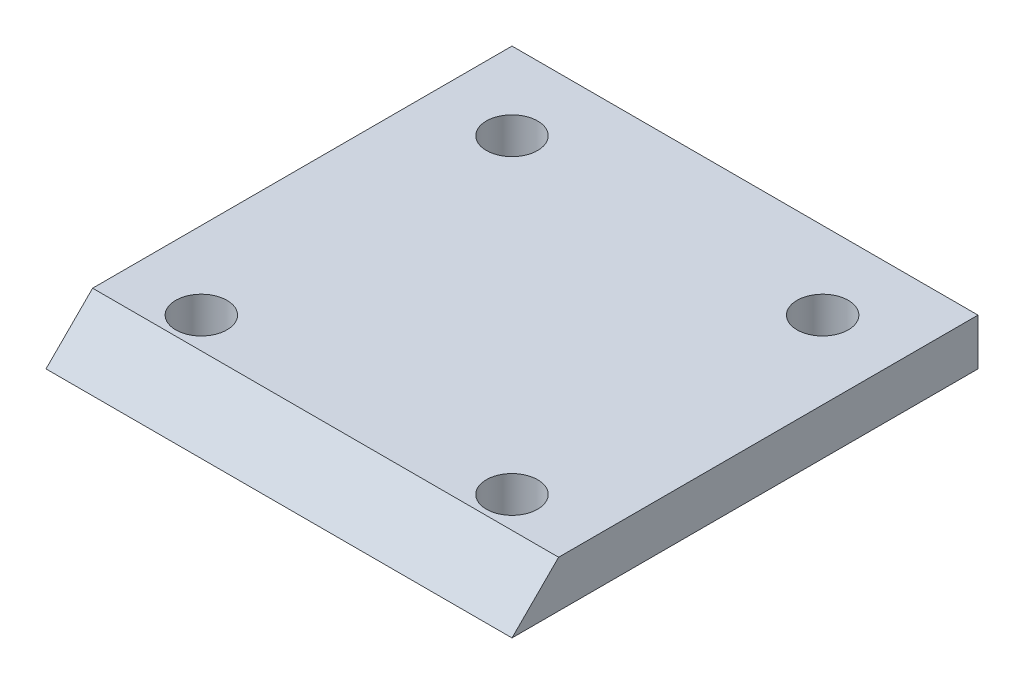
ISO-10303-21;
HEADER;
FILE_DESCRIPTION(('STEP AP214'),'2;1');
FILE_NAME('part.step','',(''),(''),'','','');
FILE_SCHEMA(('AUTOMOTIVE_DESIGN { 1 0 10303 214 1 1 1 1 }'));
ENDSEC;
DATA;
#1=APPLICATION_CONTEXT('core data for automotive mechanical design processes');
#2=APPLICATION_PROTOCOL_DEFINITION('international standard','automotive_design',2000,#1);
#3=PRODUCT_CONTEXT('',#1,'mechanical');
#4=PRODUCT('Part','Part','',(#3));
#5=PRODUCT_RELATED_PRODUCT_CATEGORY('part','',(#4));
#6=PRODUCT_DEFINITION_FORMATION('','',#4);
#7=PRODUCT_DEFINITION_CONTEXT('part definition',#1,'design');
#8=PRODUCT_DEFINITION('design','',#6,#7);
#9=PRODUCT_DEFINITION_SHAPE('','',#8);
#10=(LENGTH_UNIT() NAMED_UNIT(*) SI_UNIT(.MILLI.,.METRE.));
#11=(NAMED_UNIT(*) PLANE_ANGLE_UNIT() SI_UNIT($,.RADIAN.));
#12=(NAMED_UNIT(*) SI_UNIT($,.STERADIAN.) SOLID_ANGLE_UNIT());
#13=UNCERTAINTY_MEASURE_WITH_UNIT(LENGTH_MEASURE(1.E-05),#10,'distance_accuracy_value','');
#14=(GEOMETRIC_REPRESENTATION_CONTEXT(3) GLOBAL_UNCERTAINTY_ASSIGNED_CONTEXT((#13)) GLOBAL_UNIT_ASSIGNED_CONTEXT((#10,
#11,#12)) REPRESENTATION_CONTEXT('',''));
#15=CARTESIAN_POINT('',(0.,0.,0.));
#16=DIRECTION('',(0.,0.,1.));
#17=DIRECTION('',(1.,0.,0.));
#18=AXIS2_PLACEMENT_3D('',#15,#16,#17);
#19=CARTESIAN_POINT('',(15.,3.,15.));
#20=DIRECTION('',(-1.,0.,0.));
#21=DIRECTION('',(0.,0.,1.));
#22=AXIS2_PLACEMENT_3D('',#19,#20,#21);
#23=PLANE('',#22);
#24=DIRECTION('',(0.,0.,-1.));
#25=VECTOR('',#24,1.);
#26=CARTESIAN_POINT('',(15.,3.,15.));
#27=LINE('',#26,#25);
#28=CARTESIAN_POINT('',(15.,3.,12.));
#29=VERTEX_POINT('',#28);
#30=CARTESIAN_POINT('',(15.,3.,-15.));
#31=VERTEX_POINT('',#30);
#32=EDGE_CURVE('E82',#29,#31,#27,.T.);
#33=ORIENTED_EDGE('',*,*,#32,.F.);
#34=DIRECTION('',(0.,0.707106781186548,-0.707106781186547));
#35=VECTOR('',#34,1.);
#36=CARTESIAN_POINT('',(15.,3.,12.));
#37=LINE('',#36,#35);
#38=CARTESIAN_POINT('',(15.,0.,15.));
#39=VERTEX_POINT('',#38);
#40=EDGE_CURVE('E51',#29,#39,#37,.F.);
#41=ORIENTED_EDGE('',*,*,#40,.T.);
#42=DIRECTION('',(0.,0.,-1.));
#43=VECTOR('',#42,1.);
#44=CARTESIAN_POINT('',(15.,0.,15.));
#45=LINE('',#44,#43);
#46=CARTESIAN_POINT('',(15.,0.,-15.));
#47=VERTEX_POINT('',#46);
#48=EDGE_CURVE('E104',#39,#47,#45,.T.);
#49=ORIENTED_EDGE('',*,*,#48,.T.);
#50=DIRECTION('',(0.,-1.,0.));
#51=VECTOR('',#50,1.);
#52=CARTESIAN_POINT('',(15.,3.,-15.));
#53=LINE('',#52,#51);
#54=EDGE_CURVE('E96',#31,#47,#53,.T.);
#55=ORIENTED_EDGE('',*,*,#54,.F.);
#56=EDGE_LOOP('',(#33,#41,#49,#55));
#57=FACE_BOUND('',#56,.T.);
#58=ADVANCED_FACE('F41',(#57),#23,.F.);
#59=CARTESIAN_POINT('',(-15.,3.,-15.));
#60=DIRECTION('',(0.,0.,1.));
#61=DIRECTION('',(1.,0.,0.));
#62=AXIS2_PLACEMENT_3D('',#59,#60,#61);
#63=PLANE('',#62);
#64=DIRECTION('',(-1.,0.,0.));
#65=VECTOR('',#64,1.);
#66=CARTESIAN_POINT('',(-15.,0.,-15.));
#67=LINE('',#66,#65);
#68=CARTESIAN_POINT('',(-15.,0.,-15.));
#69=VERTEX_POINT('',#68);
#70=EDGE_CURVE('E117',#47,#69,#67,.T.);
#71=ORIENTED_EDGE('',*,*,#70,.T.);
#72=DIRECTION('',(0.,-1.,0.));
#73=VECTOR('',#72,1.);
#74=CARTESIAN_POINT('',(-15.,3.,-15.));
#75=LINE('',#74,#73);
#76=CARTESIAN_POINT('',(-15.,3.,-15.));
#77=VERTEX_POINT('',#76);
#78=EDGE_CURVE('E99',#77,#69,#75,.T.);
#79=ORIENTED_EDGE('',*,*,#78,.F.);
#80=DIRECTION('',(-1.,0.,0.));
#81=VECTOR('',#80,1.);
#82=CARTESIAN_POINT('',(-15.,3.,-15.));
#83=LINE('',#82,#81);
#84=EDGE_CURVE('E85',#31,#77,#83,.T.);
#85=ORIENTED_EDGE('',*,*,#84,.F.);
#86=ORIENTED_EDGE('',*,*,#54,.T.);
#87=EDGE_LOOP('',(#71,#79,#85,#86));
#88=FACE_BOUND('',#87,.T.);
#89=ADVANCED_FACE('F95',(#88),#63,.F.);
#90=CARTESIAN_POINT('',(-15.,3.,15.));
#91=DIRECTION('',(1.,0.,0.));
#92=DIRECTION('',(0.,0.,-1.));
#93=AXIS2_PLACEMENT_3D('',#90,#91,#92);
#94=PLANE('',#93);
#95=DIRECTION('',(0.,0.,1.));
#96=VECTOR('',#95,1.);
#97=CARTESIAN_POINT('',(-15.,0.,15.));
#98=LINE('',#97,#96);
#99=CARTESIAN_POINT('',(-15.,0.,15.));
#100=VERTEX_POINT('',#99);
#101=EDGE_CURVE('E122',#69,#100,#98,.T.);
#102=ORIENTED_EDGE('',*,*,#101,.T.);
#103=DIRECTION('',(0.,-0.707106781186548,0.707106781186547));
#104=VECTOR('',#103,1.);
#105=CARTESIAN_POINT('',(-15.,3.,12.));
#106=LINE('',#105,#104);
#107=CARTESIAN_POINT('',(-15.,3.,12.));
#108=VERTEX_POINT('',#107);
#109=EDGE_CURVE('E11',#100,#108,#106,.F.);
#110=ORIENTED_EDGE('',*,*,#109,.T.);
#111=DIRECTION('',(0.,0.,1.));
#112=VECTOR('',#111,1.);
#113=CARTESIAN_POINT('',(-15.,3.,15.));
#114=LINE('',#113,#112);
#115=EDGE_CURVE('E101',#77,#108,#114,.T.);
#116=ORIENTED_EDGE('',*,*,#115,.F.);
#117=ORIENTED_EDGE('',*,*,#78,.T.);
#118=EDGE_LOOP('',(#102,#110,#116,#117));
#119=FACE_BOUND('',#118,.T.);
#120=ADVANCED_FACE('F166',(#119),#94,.F.);
#121=CARTESIAN_POINT('',(0.,3.,0.));
#122=DIRECTION('',(0.,-1.,0.));
#123=DIRECTION('',(0.,0.,-1.));
#124=AXIS2_PLACEMENT_3D('',#121,#122,#123);
#125=PLANE('',#124);
#126=CARTESIAN_POINT('',(-10.,3.,-10.));
#127=DIRECTION('',(0.,1.,0.));
#128=DIRECTION('',(0.,0.,1.));
#129=AXIS2_PLACEMENT_3D('',#126,#127,#128);
#130=CIRCLE('',#129,1.65);
#131=CARTESIAN_POINT('',(-10.,3.,-8.35));
#132=VERTEX_POINT('',#131);
#133=EDGE_CURVE('E157',#132,#132,#130,.T.);
#134=ORIENTED_EDGE('',*,*,#133,.F.);
#135=EDGE_LOOP('',(#134));
#136=FACE_BOUND('',#135,.T.);
#137=CARTESIAN_POINT('',(10.,3.,-10.));
#138=DIRECTION('',(0.,1.,0.));
#139=DIRECTION('',(0.,0.,1.));
#140=AXIS2_PLACEMENT_3D('',#137,#138,#139);
#141=CIRCLE('',#140,1.65);
#142=CARTESIAN_POINT('',(10.,3.,-8.35));
#143=VERTEX_POINT('',#142);
#144=EDGE_CURVE('E149',#143,#143,#141,.T.);
#145=ORIENTED_EDGE('',*,*,#144,.F.);
#146=EDGE_LOOP('',(#145));
#147=FACE_BOUND('',#146,.T.);
#148=CARTESIAN_POINT('',(10.,3.,10.));
#149=DIRECTION('',(0.,1.,0.));
#150=DIRECTION('',(0.,0.,1.));
#151=AXIS2_PLACEMENT_3D('',#148,#149,#150);
#152=CIRCLE('',#151,1.65);
#153=CARTESIAN_POINT('',(10.,3.,11.65));
#154=VERTEX_POINT('',#153);
#155=EDGE_CURVE('E141',#154,#154,#152,.T.);
#156=ORIENTED_EDGE('',*,*,#155,.F.);
#157=EDGE_LOOP('',(#156));
#158=FACE_BOUND('',#157,.T.);
#159=CARTESIAN_POINT('',(-10.,3.,10.));
#160=DIRECTION('',(0.,1.,0.));
#161=DIRECTION('',(0.,0.,1.));
#162=AXIS2_PLACEMENT_3D('',#159,#160,#161);
#163=CIRCLE('',#162,1.65);
#164=CARTESIAN_POINT('',(-10.,3.,11.65));
#165=VERTEX_POINT('',#164);
#166=EDGE_CURVE('E133',#165,#165,#163,.T.);
#167=ORIENTED_EDGE('',*,*,#166,.F.);
#168=EDGE_LOOP('',(#167));
#169=FACE_BOUND('',#168,.T.);
#170=ORIENTED_EDGE('',*,*,#115,.T.);
#171=DIRECTION('',(1.,0.,0.));
#172=VECTOR('',#171,1.);
#173=CARTESIAN_POINT('',(0.,3.,12.));
#174=LINE('',#173,#172);
#175=EDGE_CURVE('E87',#108,#29,#174,.T.);
#176=ORIENTED_EDGE('',*,*,#175,.T.);
#177=ORIENTED_EDGE('',*,*,#32,.T.);
#178=ORIENTED_EDGE('',*,*,#84,.T.);
#179=EDGE_LOOP('',(#170,#176,#177,#178));
#180=FACE_BOUND('',#179,.T.);
#181=ADVANCED_FACE('F84',(#136,#147,#158,#169,#180),#125,.F.);
#182=CARTESIAN_POINT('',(0.,0.,0.));
#183=DIRECTION('',(0.,-1.,0.));
#184=DIRECTION('',(0.,0.,-1.));
#185=AXIS2_PLACEMENT_3D('',#182,#183,#184);
#186=PLANE('',#185);
#187=CARTESIAN_POINT('',(-10.,0.,-10.));
#188=DIRECTION('',(0.,1.,0.));
#189=DIRECTION('',(0.,0.,1.));
#190=AXIS2_PLACEMENT_3D('',#187,#188,#189);
#191=CIRCLE('',#190,1.65);
#192=CARTESIAN_POINT('',(-10.,0.,-8.35));
#193=VERTEX_POINT('',#192);
#194=EDGE_CURVE('E153',#193,#193,#191,.T.);
#195=ORIENTED_EDGE('',*,*,#194,.T.);
#196=EDGE_LOOP('',(#195));
#197=FACE_BOUND('',#196,.T.);
#198=CARTESIAN_POINT('',(10.,0.,-10.));
#199=DIRECTION('',(0.,1.,0.));
#200=DIRECTION('',(0.,0.,1.));
#201=AXIS2_PLACEMENT_3D('',#198,#199,#200);
#202=CIRCLE('',#201,1.65);
#203=CARTESIAN_POINT('',(10.,0.,-8.35));
#204=VERTEX_POINT('',#203);
#205=EDGE_CURVE('E145',#204,#204,#202,.T.);
#206=ORIENTED_EDGE('',*,*,#205,.T.);
#207=EDGE_LOOP('',(#206));
#208=FACE_BOUND('',#207,.T.);
#209=CARTESIAN_POINT('',(10.,0.,10.));
#210=DIRECTION('',(0.,1.,0.));
#211=DIRECTION('',(0.,0.,1.));
#212=AXIS2_PLACEMENT_3D('',#209,#210,#211);
#213=CIRCLE('',#212,1.65);
#214=CARTESIAN_POINT('',(10.,0.,11.65));
#215=VERTEX_POINT('',#214);
#216=EDGE_CURVE('E137',#215,#215,#213,.T.);
#217=ORIENTED_EDGE('',*,*,#216,.T.);
#218=EDGE_LOOP('',(#217));
#219=FACE_BOUND('',#218,.T.);
#220=CARTESIAN_POINT('',(-10.,0.,10.));
#221=DIRECTION('',(0.,1.,0.));
#222=DIRECTION('',(0.,0.,1.));
#223=AXIS2_PLACEMENT_3D('',#220,#221,#222);
#224=CIRCLE('',#223,1.65);
#225=CARTESIAN_POINT('',(-10.,0.,11.65));
#226=VERTEX_POINT('',#225);
#227=EDGE_CURVE('E119',#226,#226,#224,.T.);
#228=ORIENTED_EDGE('',*,*,#227,.T.);
#229=EDGE_LOOP('',(#228));
#230=FACE_BOUND('',#229,.T.);
#231=ORIENTED_EDGE('',*,*,#48,.F.);
#232=DIRECTION('',(1.,0.,0.));
#233=VECTOR('',#232,1.);
#234=CARTESIAN_POINT('',(-15.,0.,15.));
#235=LINE('',#234,#233);
#236=EDGE_CURVE('E91',#100,#39,#235,.T.);
#237=ORIENTED_EDGE('',*,*,#236,.F.);
#238=ORIENTED_EDGE('',*,*,#101,.F.);
#239=ORIENTED_EDGE('',*,*,#70,.F.);
#240=EDGE_LOOP('',(#231,#237,#238,#239));
#241=FACE_BOUND('',#240,.T.);
#242=ADVANCED_FACE('F115',(#197,#208,#219,#230,#241),#186,.T.);
#243=CARTESIAN_POINT('',(-10.,3.,10.));
#244=DIRECTION('',(0.,1.,0.));
#245=DIRECTION('',(0.,0.,1.));
#246=AXIS2_PLACEMENT_3D('',#243,#244,#245);
#247=CYLINDRICAL_SURFACE('',#246,1.65);
#248=ORIENTED_EDGE('',*,*,#227,.F.);
#249=EDGE_LOOP('',(#248));
#250=FACE_BOUND('',#249,.T.);
#251=ORIENTED_EDGE('',*,*,#166,.T.);
#252=EDGE_LOOP('',(#251));
#253=FACE_BOUND('',#252,.T.);
#254=ADVANCED_FACE('F174',(#250,#253),#247,.F.);
#255=CARTESIAN_POINT('',(10.,3.,10.));
#256=DIRECTION('',(0.,1.,0.));
#257=DIRECTION('',(0.,0.,1.));
#258=AXIS2_PLACEMENT_3D('',#255,#256,#257);
#259=CYLINDRICAL_SURFACE('',#258,1.65);
#260=ORIENTED_EDGE('',*,*,#216,.F.);
#261=EDGE_LOOP('',(#260));
#262=FACE_BOUND('',#261,.T.);
#263=ORIENTED_EDGE('',*,*,#155,.T.);
#264=EDGE_LOOP('',(#263));
#265=FACE_BOUND('',#264,.T.);
#266=ADVANCED_FACE('F176',(#262,#265),#259,.F.);
#267=CARTESIAN_POINT('',(10.,3.,-10.));
#268=DIRECTION('',(0.,1.,0.));
#269=DIRECTION('',(0.,0.,1.));
#270=AXIS2_PLACEMENT_3D('',#267,#268,#269);
#271=CYLINDRICAL_SURFACE('',#270,1.65);
#272=ORIENTED_EDGE('',*,*,#205,.F.);
#273=EDGE_LOOP('',(#272));
#274=FACE_BOUND('',#273,.T.);
#275=ORIENTED_EDGE('',*,*,#144,.T.);
#276=EDGE_LOOP('',(#275));
#277=FACE_BOUND('',#276,.T.);
#278=ADVANCED_FACE('F183',(#274,#277),#271,.F.);
#279=CARTESIAN_POINT('',(-10.,3.,-10.));
#280=DIRECTION('',(0.,1.,0.));
#281=DIRECTION('',(0.,0.,1.));
#282=AXIS2_PLACEMENT_3D('',#279,#280,#281);
#283=CYLINDRICAL_SURFACE('',#282,1.65);
#284=ORIENTED_EDGE('',*,*,#194,.F.);
#285=EDGE_LOOP('',(#284));
#286=FACE_BOUND('',#285,.T.);
#287=ORIENTED_EDGE('',*,*,#133,.T.);
#288=EDGE_LOOP('',(#287));
#289=FACE_BOUND('',#288,.T.);
#290=ADVANCED_FACE('F162',(#286,#289),#283,.F.);
#291=CARTESIAN_POINT('',(0.,3.,12.));
#292=DIRECTION('',(0.,-0.707106781186547,-0.707106781186548));
#293=DIRECTION('',(1.,0.,0.));
#294=AXIS2_PLACEMENT_3D('',#291,#292,#293);
#295=PLANE('',#294);
#296=ORIENTED_EDGE('',*,*,#109,.F.);
#297=ORIENTED_EDGE('',*,*,#236,.T.);
#298=ORIENTED_EDGE('',*,*,#40,.F.);
#299=ORIENTED_EDGE('',*,*,#175,.F.);
#300=EDGE_LOOP('',(#296,#297,#298,#299));
#301=FACE_BOUND('',#300,.T.);
#302=ADVANCED_FACE('F44',(#301),#295,.F.);
#303=CLOSED_SHELL('',(#58,#89,#120,#181,#242,#254,#266,#278,#290,#302));
#304=MANIFOLD_SOLID_BREP('B2',#303);
#305=ADVANCED_BREP_SHAPE_REPRESENTATION('',(#18,#304),#14);
#306=SHAPE_DEFINITION_REPRESENTATION(#9,#305);
ENDSEC;
END-ISO-10303-21;
